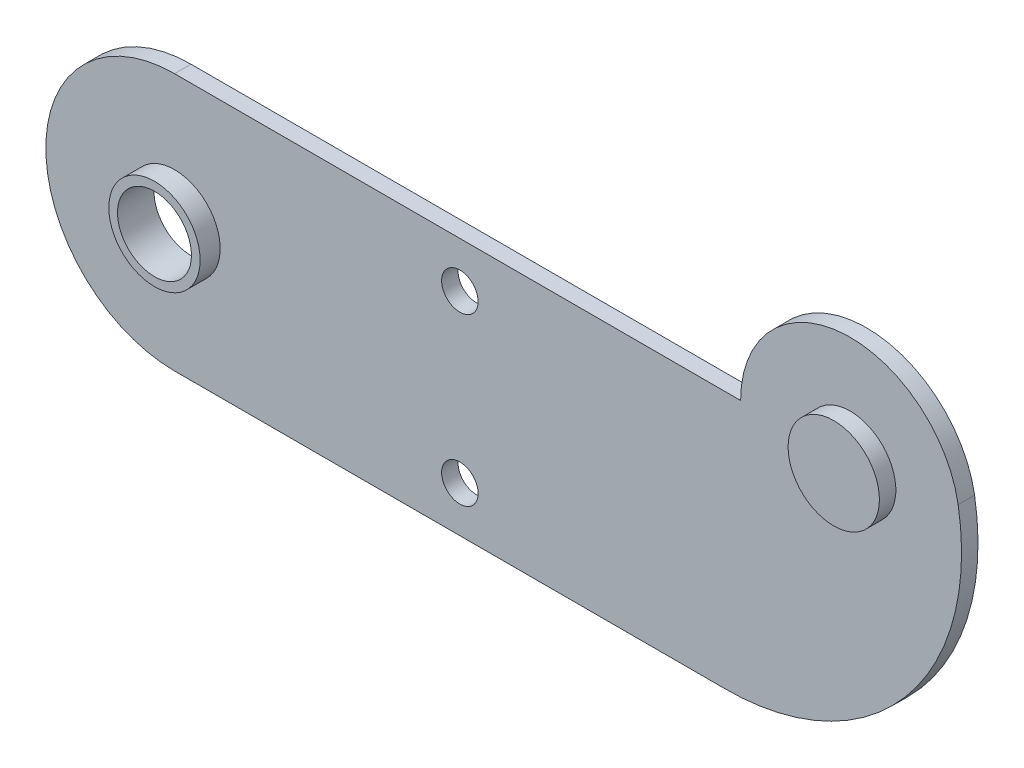
ISO-10303-21;
HEADER;
FILE_DESCRIPTION(('STEP AP214'),'2;1');
FILE_NAME('part.step','',(''),(''),'','','');
FILE_SCHEMA(('AUTOMOTIVE_DESIGN { 1 0 10303 214 1 1 1 1 }'));
ENDSEC;
DATA;
#1=APPLICATION_CONTEXT('core data for automotive mechanical design processes');
#2=APPLICATION_PROTOCOL_DEFINITION('international standard','automotive_design',2000,#1);
#3=PRODUCT_CONTEXT('',#1,'mechanical');
#4=PRODUCT('Part','Part','',(#3));
#5=PRODUCT_RELATED_PRODUCT_CATEGORY('part','',(#4));
#6=PRODUCT_DEFINITION_FORMATION('','',#4);
#7=PRODUCT_DEFINITION_CONTEXT('part definition',#1,'design');
#8=PRODUCT_DEFINITION('design','',#6,#7);
#9=PRODUCT_DEFINITION_SHAPE('','',#8);
#10=(LENGTH_UNIT() NAMED_UNIT(*) SI_UNIT(.MILLI.,.METRE.));
#11=(NAMED_UNIT(*) PLANE_ANGLE_UNIT() SI_UNIT($,.RADIAN.));
#12=(NAMED_UNIT(*) SI_UNIT($,.STERADIAN.) SOLID_ANGLE_UNIT());
#13=UNCERTAINTY_MEASURE_WITH_UNIT(LENGTH_MEASURE(1.E-05),#10,'distance_accuracy_value','');
#14=(GEOMETRIC_REPRESENTATION_CONTEXT(3) GLOBAL_UNCERTAINTY_ASSIGNED_CONTEXT((#13)) GLOBAL_UNIT_ASSIGNED_CONTEXT((#10,
#11,#12)) REPRESENTATION_CONTEXT('',''));
#15=CARTESIAN_POINT('',(0.,0.,0.));
#16=DIRECTION('',(0.,0.,1.));
#17=DIRECTION('',(1.,0.,0.));
#18=AXIS2_PLACEMENT_3D('',#15,#16,#17);
#19=CARTESIAN_POINT('',(0.,0.,1.8));
#20=DIRECTION('',(0.,0.,-1.));
#21=DIRECTION('',(-1.,0.,0.));
#22=AXIS2_PLACEMENT_3D('',#19,#20,#21);
#23=PLANE('',#22);
#24=CARTESIAN_POINT('',(-42.75,-23.2,1.8));
#25=DIRECTION('',(0.,0.,1.));
#26=DIRECTION('',(1.,0.,0.));
#27=AXIS2_PLACEMENT_3D('',#24,#25,#26);
#28=CIRCLE('',#27,2.00000000000001);
#29=CARTESIAN_POINT('',(-40.75,-23.2,1.8));
#30=VERTEX_POINT('',#29);
#31=EDGE_CURVE('E153',#30,#30,#28,.T.);
#32=ORIENTED_EDGE('',*,*,#31,.F.);
#33=EDGE_LOOP('',(#32));
#34=FACE_BOUND('',#33,.T.);
#35=CARTESIAN_POINT('',(-42.75,-5.,1.8));
#36=DIRECTION('',(0.,0.,1.));
#37=DIRECTION('',(1.,0.,0.));
#38=AXIS2_PLACEMENT_3D('',#35,#36,#37);
#39=CIRCLE('',#38,2.);
#40=CARTESIAN_POINT('',(-40.75,-5.,1.8));
#41=VERTEX_POINT('',#40);
#42=EDGE_CURVE('E162',#41,#41,#39,.T.);
#43=ORIENTED_EDGE('',*,*,#42,.F.);
#44=EDGE_LOOP('',(#43));
#45=FACE_BOUND('',#44,.T.);
#46=CARTESIAN_POINT('',(0.,0.,1.8));
#47=DIRECTION('',(0.,0.,1.));
#48=DIRECTION('',(-1.,0.,0.));
#49=AXIS2_PLACEMENT_3D('',#46,#47,#48);
#50=CIRCLE('',#49,12.);
#51=CARTESIAN_POINT('',(11.8263011377595,2.0343552784675,1.8));
#52=VERTEX_POINT('',#51);
#53=CARTESIAN_POINT('',(-12.,0.,1.8));
#54=VERTEX_POINT('',#53);
#55=EDGE_CURVE('E135',#52,#54,#50,.T.);
#56=ORIENTED_EDGE('',*,*,#55,.T.);
#57=DIRECTION('',(-1.,0.,0.));
#58=VECTOR('',#57,1.);
#59=CARTESIAN_POINT('',(-12.,0.,1.8));
#60=LINE('',#59,#58);
#61=CARTESIAN_POINT('',(-74.,0.,1.8));
#62=VERTEX_POINT('',#61);
#63=EDGE_CURVE('E92',#54,#62,#60,.T.);
#64=ORIENTED_EDGE('',*,*,#63,.T.);
#65=CARTESIAN_POINT('',(-74.,-14.1,1.8));
#66=DIRECTION('',(0.,0.,1.));
#67=DIRECTION('',(1.,0.,0.));
#68=AXIS2_PLACEMENT_3D('',#65,#66,#67);
#69=CIRCLE('',#68,14.1);
#70=CARTESIAN_POINT('',(-74.,-28.2,1.8));
#71=VERTEX_POINT('',#70);
#72=EDGE_CURVE('E96',#62,#71,#69,.T.);
#73=ORIENTED_EDGE('',*,*,#72,.T.);
#74=DIRECTION('',(1.,0.,0.));
#75=VECTOR('',#74,1.);
#76=CARTESIAN_POINT('',(-14.,-28.2,1.8));
#77=LINE('',#76,#75);
#78=CARTESIAN_POINT('',(-14.,-28.2,1.8));
#79=VERTEX_POINT('',#78);
#80=EDGE_CURVE('E100',#71,#79,#77,.T.);
#81=ORIENTED_EDGE('',*,*,#80,.T.);
#82=CARTESIAN_POINT('',(-13.6531808269559,-2.34861434354199,1.8));
#83=DIRECTION('',(0.,0.,1.));
#84=DIRECTION('',(-1.,0.,0.));
#85=AXIS2_PLACEMENT_3D('',#82,#83,#84);
#86=CIRCLE('',#85,25.8537119945611);
#87=EDGE_CURVE('E57',#79,#52,#86,.T.);
#88=ORIENTED_EDGE('',*,*,#87,.T.);
#89=EDGE_LOOP('',(#56,#64,#73,#81,#88));
#90=FACE_BOUND('',#89,.T.);
#91=CARTESIAN_POINT('',(0.,0.,1.8));
#92=DIRECTION('',(0.,0.,-1.));
#93=DIRECTION('',(-1.,0.,0.));
#94=AXIS2_PLACEMENT_3D('',#91,#92,#93);
#95=CIRCLE('',#94,5.);
#96=CARTESIAN_POINT('',(-5.,0.,1.8));
#97=VERTEX_POINT('',#96);
#98=EDGE_CURVE('E49',#97,#97,#95,.F.);
#99=ORIENTED_EDGE('',*,*,#98,.F.);
#100=EDGE_LOOP('',(#99));
#101=FACE_BOUND('',#100,.T.);
#102=CARTESIAN_POINT('',(-74.,-14.1,1.8));
#103=DIRECTION('',(0.,0.,-1.));
#104=DIRECTION('',(-1.,0.,0.));
#105=AXIS2_PLACEMENT_3D('',#102,#103,#104);
#106=CIRCLE('',#105,4.99999999999999);
#107=CARTESIAN_POINT('',(-79.,-14.1,1.8));
#108=VERTEX_POINT('',#107);
#109=EDGE_CURVE('E11',#108,#108,#106,.F.);
#110=ORIENTED_EDGE('',*,*,#109,.F.);
#111=EDGE_LOOP('',(#110));
#112=FACE_BOUND('',#111,.T.);
#113=ADVANCED_FACE('F39',(#34,#45,#90,#101,#112),#23,.F.);
#114=CARTESIAN_POINT('',(0.,0.,0.));
#115=DIRECTION('',(0.,0.,-1.));
#116=DIRECTION('',(-1.,0.,0.));
#117=AXIS2_PLACEMENT_3D('',#114,#115,#116);
#118=PLANE('',#117);
#119=CARTESIAN_POINT('',(-42.75,-5.,0.));
#120=DIRECTION('',(0.,0.,1.));
#121=DIRECTION('',(1.,0.,0.));
#122=AXIS2_PLACEMENT_3D('',#119,#120,#121);
#123=CIRCLE('',#122,2.);
#124=CARTESIAN_POINT('',(-40.75,-5.,0.));
#125=VERTEX_POINT('',#124);
#126=EDGE_CURVE('E157',#125,#125,#123,.T.);
#127=ORIENTED_EDGE('',*,*,#126,.T.);
#128=EDGE_LOOP('',(#127));
#129=FACE_BOUND('',#128,.T.);
#130=CARTESIAN_POINT('',(0.,0.,0.));
#131=DIRECTION('',(0.,0.,1.));
#132=DIRECTION('',(-1.,0.,0.));
#133=AXIS2_PLACEMENT_3D('',#130,#131,#132);
#134=CIRCLE('',#133,12.);
#135=CARTESIAN_POINT('',(11.8263011377595,2.0343552784675,0.));
#136=VERTEX_POINT('',#135);
#137=CARTESIAN_POINT('',(-12.,0.,0.));
#138=VERTEX_POINT('',#137);
#139=EDGE_CURVE('E121',#136,#138,#134,.T.);
#140=ORIENTED_EDGE('',*,*,#139,.F.);
#141=CARTESIAN_POINT('',(-13.6531808269559,-2.34861434354199,0.));
#142=DIRECTION('',(0.,0.,1.));
#143=DIRECTION('',(-1.,0.,0.));
#144=AXIS2_PLACEMENT_3D('',#141,#142,#143);
#145=CIRCLE('',#144,25.8537119945611);
#146=CARTESIAN_POINT('',(-14.,-28.2,0.));
#147=VERTEX_POINT('',#146);
#148=EDGE_CURVE('E83',#147,#136,#145,.T.);
#149=ORIENTED_EDGE('',*,*,#148,.F.);
#150=DIRECTION('',(1.,0.,0.));
#151=VECTOR('',#150,1.);
#152=CARTESIAN_POINT('',(-14.,-28.2,0.));
#153=LINE('',#152,#151);
#154=CARTESIAN_POINT('',(-74.,-28.2,0.));
#155=VERTEX_POINT('',#154);
#156=EDGE_CURVE('E77',#155,#147,#153,.T.);
#157=ORIENTED_EDGE('',*,*,#156,.F.);
#158=CARTESIAN_POINT('',(-74.,-14.1,0.));
#159=DIRECTION('',(0.,0.,1.));
#160=DIRECTION('',(1.,0.,0.));
#161=AXIS2_PLACEMENT_3D('',#158,#159,#160);
#162=CIRCLE('',#161,14.1);
#163=CARTESIAN_POINT('',(-74.,0.,0.));
#164=VERTEX_POINT('',#163);
#165=EDGE_CURVE('E108',#164,#155,#162,.T.);
#166=ORIENTED_EDGE('',*,*,#165,.F.);
#167=DIRECTION('',(-1.,0.,0.));
#168=VECTOR('',#167,1.);
#169=CARTESIAN_POINT('',(-12.,0.,0.));
#170=LINE('',#169,#168);
#171=EDGE_CURVE('E125',#138,#164,#170,.T.);
#172=ORIENTED_EDGE('',*,*,#171,.F.);
#173=EDGE_LOOP('',(#140,#149,#157,#166,#172));
#174=FACE_BOUND('',#173,.T.);
#175=CARTESIAN_POINT('',(-74.,-14.1,0.));
#176=DIRECTION('',(0.,0.,1.));
#177=DIRECTION('',(1.,0.,0.));
#178=AXIS2_PLACEMENT_3D('',#175,#176,#177);
#179=CIRCLE('',#178,4.05);
#180=CARTESIAN_POINT('',(-69.95,-14.1,0.));
#181=VERTEX_POINT('',#180);
#182=EDGE_CURVE('E126',#181,#181,#179,.T.);
#183=ORIENTED_EDGE('',*,*,#182,.T.);
#184=EDGE_LOOP('',(#183));
#185=FACE_BOUND('',#184,.T.);
#186=CARTESIAN_POINT('',(-42.75,-23.2,0.));
#187=DIRECTION('',(0.,0.,1.));
#188=DIRECTION('',(1.,0.,0.));
#189=AXIS2_PLACEMENT_3D('',#186,#187,#188);
#190=CIRCLE('',#189,2.00000000000001);
#191=CARTESIAN_POINT('',(-40.75,-23.2,0.));
#192=VERTEX_POINT('',#191);
#193=EDGE_CURVE('E158',#192,#192,#190,.T.);
#194=ORIENTED_EDGE('',*,*,#193,.T.);
#195=EDGE_LOOP('',(#194));
#196=FACE_BOUND('',#195,.T.);
#197=ADVANCED_FACE('F203',(#129,#174,#185,#196),#118,.T.);
#198=CARTESIAN_POINT('',(0.,0.,1.8));
#199=DIRECTION('',(0.,0.,-1.));
#200=DIRECTION('',(-1.,0.,0.));
#201=AXIS2_PLACEMENT_3D('',#198,#199,#200);
#202=CYLINDRICAL_SURFACE('',#201,12.);
#203=ORIENTED_EDGE('',*,*,#139,.T.);
#204=DIRECTION('',(0.,0.,-1.));
#205=VECTOR('',#204,1.);
#206=CARTESIAN_POINT('',(-12.,0.,1.8));
#207=LINE('',#206,#205);
#208=EDGE_CURVE('E141',#54,#138,#207,.T.);
#209=ORIENTED_EDGE('',*,*,#208,.F.);
#210=ORIENTED_EDGE('',*,*,#55,.F.);
#211=DIRECTION('',(0.,0.,-1.));
#212=VECTOR('',#211,1.);
#213=CARTESIAN_POINT('',(11.8263011377595,2.0343552784675,1.8));
#214=LINE('',#213,#212);
#215=EDGE_CURVE('E117',#52,#136,#214,.T.);
#216=ORIENTED_EDGE('',*,*,#215,.T.);
#217=EDGE_LOOP('',(#203,#209,#210,#216));
#218=FACE_BOUND('',#217,.T.);
#219=ADVANCED_FACE('F41',(#218),#202,.T.);
#220=CARTESIAN_POINT('',(-12.,0.,1.8));
#221=DIRECTION('',(0.,-1.,0.));
#222=DIRECTION('',(1.,0.,0.));
#223=AXIS2_PLACEMENT_3D('',#220,#221,#222);
#224=PLANE('',#223);
#225=ORIENTED_EDGE('',*,*,#171,.T.);
#226=DIRECTION('',(0.,0.,-1.));
#227=VECTOR('',#226,1.);
#228=CARTESIAN_POINT('',(-74.,0.,1.8));
#229=LINE('',#228,#227);
#230=EDGE_CURVE('E110',#62,#164,#229,.T.);
#231=ORIENTED_EDGE('',*,*,#230,.F.);
#232=ORIENTED_EDGE('',*,*,#63,.F.);
#233=ORIENTED_EDGE('',*,*,#208,.T.);
#234=EDGE_LOOP('',(#225,#231,#232,#233));
#235=FACE_BOUND('',#234,.T.);
#236=ADVANCED_FACE('F222',(#235),#224,.F.);
#237=CARTESIAN_POINT('',(-74.,-14.1,1.8));
#238=DIRECTION('',(0.,0.,-1.));
#239=DIRECTION('',(-1.,0.,0.));
#240=AXIS2_PLACEMENT_3D('',#237,#238,#239);
#241=CYLINDRICAL_SURFACE('',#240,14.1);
#242=ORIENTED_EDGE('',*,*,#165,.T.);
#243=DIRECTION('',(0.,0.,-1.));
#244=VECTOR('',#243,1.);
#245=CARTESIAN_POINT('',(-74.,-28.2,1.8));
#246=LINE('',#245,#244);
#247=EDGE_CURVE('E105',#71,#155,#246,.T.);
#248=ORIENTED_EDGE('',*,*,#247,.F.);
#249=ORIENTED_EDGE('',*,*,#72,.F.);
#250=ORIENTED_EDGE('',*,*,#230,.T.);
#251=EDGE_LOOP('',(#242,#248,#249,#250));
#252=FACE_BOUND('',#251,.T.);
#253=ADVANCED_FACE('F106',(#252),#241,.T.);
#254=CARTESIAN_POINT('',(-14.,-28.2,1.8));
#255=DIRECTION('',(0.,1.,0.));
#256=DIRECTION('',(-1.,0.,0.));
#257=AXIS2_PLACEMENT_3D('',#254,#255,#256);
#258=PLANE('',#257);
#259=ORIENTED_EDGE('',*,*,#156,.T.);
#260=DIRECTION('',(0.,0.,-1.));
#261=VECTOR('',#260,1.);
#262=CARTESIAN_POINT('',(-14.,-28.2,1.8));
#263=LINE('',#262,#261);
#264=EDGE_CURVE('E111',#79,#147,#263,.T.);
#265=ORIENTED_EDGE('',*,*,#264,.F.);
#266=ORIENTED_EDGE('',*,*,#80,.F.);
#267=ORIENTED_EDGE('',*,*,#247,.T.);
#268=EDGE_LOOP('',(#259,#265,#266,#267));
#269=FACE_BOUND('',#268,.T.);
#270=ADVANCED_FACE('F113',(#269),#258,.F.);
#271=CARTESIAN_POINT('',(-13.6531808269559,-2.34861434354199,1.8));
#272=DIRECTION('',(0.,0.,-1.));
#273=DIRECTION('',(-1.,0.,0.));
#274=AXIS2_PLACEMENT_3D('',#271,#272,#273);
#275=CYLINDRICAL_SURFACE('',#274,25.8537119945611);
#276=ORIENTED_EDGE('',*,*,#148,.T.);
#277=ORIENTED_EDGE('',*,*,#215,.F.);
#278=ORIENTED_EDGE('',*,*,#87,.F.);
#279=ORIENTED_EDGE('',*,*,#264,.T.);
#280=EDGE_LOOP('',(#276,#277,#278,#279));
#281=FACE_BOUND('',#280,.T.);
#282=ADVANCED_FACE('F216',(#281),#275,.T.);
#283=CARTESIAN_POINT('',(-74.,-14.1,1.8));
#284=DIRECTION('',(0.,0.,-1.));
#285=DIRECTION('',(-1.,0.,0.));
#286=AXIS2_PLACEMENT_3D('',#283,#284,#285);
#287=CYLINDRICAL_SURFACE('',#286,4.05);
#288=ORIENTED_EDGE('',*,*,#182,.F.);
#289=EDGE_LOOP('',(#288));
#290=FACE_BOUND('',#289,.T.);
#291=CARTESIAN_POINT('',(-74.,-14.1,4.));
#292=DIRECTION('',(0.,0.,1.));
#293=DIRECTION('',(1.,0.,0.));
#294=AXIS2_PLACEMENT_3D('',#291,#292,#293);
#295=CIRCLE('',#294,4.05);
#296=CARTESIAN_POINT('',(-69.95,-14.1,4.));
#297=VERTEX_POINT('',#296);
#298=EDGE_CURVE('E180',#297,#297,#295,.T.);
#299=ORIENTED_EDGE('',*,*,#298,.T.);
#300=EDGE_LOOP('',(#299));
#301=FACE_BOUND('',#300,.T.);
#302=ADVANCED_FACE('F185',(#290,#301),#287,.F.);
#303=CARTESIAN_POINT('',(-42.75,-5.,1.8));
#304=DIRECTION('',(0.,0.,-1.));
#305=DIRECTION('',(-1.,0.,0.));
#306=AXIS2_PLACEMENT_3D('',#303,#304,#305);
#307=CYLINDRICAL_SURFACE('',#306,2.);
#308=ORIENTED_EDGE('',*,*,#42,.T.);
#309=EDGE_LOOP('',(#308));
#310=FACE_BOUND('',#309,.T.);
#311=ORIENTED_EDGE('',*,*,#126,.F.);
#312=EDGE_LOOP('',(#311));
#313=FACE_BOUND('',#312,.T.);
#314=ADVANCED_FACE('F238',(#310,#313),#307,.F.);
#315=CARTESIAN_POINT('',(-42.75,-23.2,1.8));
#316=DIRECTION('',(0.,0.,-1.));
#317=DIRECTION('',(-1.,0.,0.));
#318=AXIS2_PLACEMENT_3D('',#315,#316,#317);
#319=CYLINDRICAL_SURFACE('',#318,2.00000000000001);
#320=ORIENTED_EDGE('',*,*,#31,.T.);
#321=EDGE_LOOP('',(#320));
#322=FACE_BOUND('',#321,.T.);
#323=ORIENTED_EDGE('',*,*,#193,.F.);
#324=EDGE_LOOP('',(#323));
#325=FACE_BOUND('',#324,.T.);
#326=ADVANCED_FACE('F236',(#322,#325),#319,.F.);
#327=CARTESIAN_POINT('',(0.,0.,3.6));
#328=DIRECTION('',(0.,0.,-1.));
#329=DIRECTION('',(-1.,0.,0.));
#330=AXIS2_PLACEMENT_3D('',#327,#328,#329);
#331=CYLINDRICAL_SURFACE('',#330,5.);
#332=CARTESIAN_POINT('',(0.,0.,3.6));
#333=DIRECTION('',(0.,0.,1.));
#334=DIRECTION('',(1.,0.,0.));
#335=AXIS2_PLACEMENT_3D('',#332,#333,#334);
#336=CIRCLE('',#335,5.);
#337=CARTESIAN_POINT('',(5.,0.,3.6));
#338=VERTEX_POINT('',#337);
#339=EDGE_CURVE('E151',#338,#338,#336,.T.);
#340=ORIENTED_EDGE('',*,*,#339,.F.);
#341=EDGE_LOOP('',(#340));
#342=FACE_BOUND('',#341,.T.);
#343=ORIENTED_EDGE('',*,*,#98,.T.);
#344=EDGE_LOOP('',(#343));
#345=FACE_BOUND('',#344,.T.);
#346=ADVANCED_FACE('F199',(#342,#345),#331,.T.);
#347=CARTESIAN_POINT('',(0.,0.,3.6));
#348=DIRECTION('',(0.,0.,1.));
#349=DIRECTION('',(1.,0.,0.));
#350=AXIS2_PLACEMENT_3D('',#347,#348,#349);
#351=PLANE('',#350);
#352=ORIENTED_EDGE('',*,*,#339,.T.);
#353=EDGE_LOOP('',(#352));
#354=FACE_BOUND('',#353,.T.);
#355=ADVANCED_FACE('F190',(#354),#351,.T.);
#356=CARTESIAN_POINT('',(-74.,-14.1,4.));
#357=DIRECTION('',(0.,0.,1.));
#358=DIRECTION('',(1.,0.,0.));
#359=AXIS2_PLACEMENT_3D('',#356,#357,#358);
#360=PLANE('',#359);
#361=CARTESIAN_POINT('',(-74.,-14.1,4.));
#362=DIRECTION('',(0.,0.,1.));
#363=DIRECTION('',(1.,0.,0.));
#364=AXIS2_PLACEMENT_3D('',#361,#362,#363);
#365=CIRCLE('',#364,4.99999999999999);
#366=CARTESIAN_POINT('',(-69.,-14.1,4.));
#367=VERTEX_POINT('',#366);
#368=EDGE_CURVE('E177',#367,#367,#365,.T.);
#369=ORIENTED_EDGE('',*,*,#368,.T.);
#370=EDGE_LOOP('',(#369));
#371=FACE_BOUND('',#370,.T.);
#372=ORIENTED_EDGE('',*,*,#298,.F.);
#373=EDGE_LOOP('',(#372));
#374=FACE_BOUND('',#373,.T.);
#375=ADVANCED_FACE('F187',(#371,#374),#360,.T.);
#376=CARTESIAN_POINT('',(-74.,-14.1,4.));
#377=DIRECTION('',(0.,0.,-1.));
#378=DIRECTION('',(-1.,0.,0.));
#379=AXIS2_PLACEMENT_3D('',#376,#377,#378);
#380=CYLINDRICAL_SURFACE('',#379,4.99999999999999);
#381=ORIENTED_EDGE('',*,*,#368,.F.);
#382=EDGE_LOOP('',(#381));
#383=FACE_BOUND('',#382,.T.);
#384=ORIENTED_EDGE('',*,*,#109,.T.);
#385=EDGE_LOOP('',(#384));
#386=FACE_BOUND('',#385,.T.);
#387=ADVANCED_FACE('F189',(#383,#386),#380,.T.);
#388=CLOSED_SHELL('',(#113,#197,#219,#236,#253,#270,#282,#302,#314,#326,#346,#355,#375,#387));
#389=MANIFOLD_SOLID_BREP('B2',#388);
#390=ADVANCED_BREP_SHAPE_REPRESENTATION('',(#18,#389),#14);
#391=SHAPE_DEFINITION_REPRESENTATION(#9,#390);
ENDSEC;
END-ISO-10303-21;
